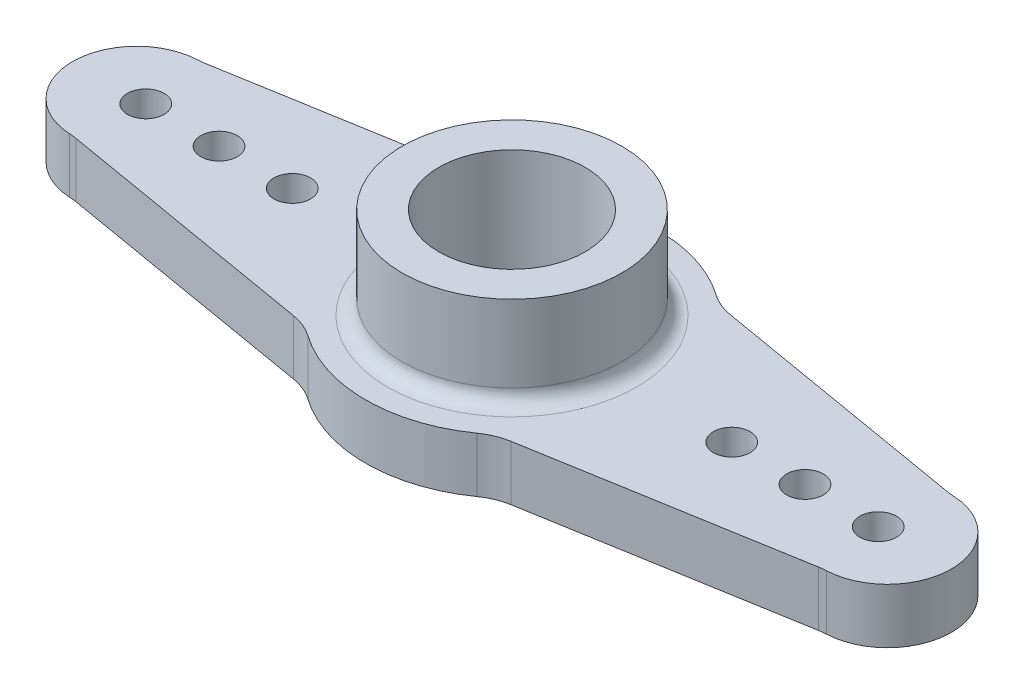
ISO-10303-21;
HEADER;
FILE_DESCRIPTION(('STEP AP214'),'2;1');
FILE_NAME('part.step','',(''),(''),'','','');
FILE_SCHEMA(('AUTOMOTIVE_DESIGN { 1 0 10303 214 1 1 1 1 }'));
ENDSEC;
DATA;
#1=APPLICATION_CONTEXT('core data for automotive mechanical design processes');
#2=APPLICATION_PROTOCOL_DEFINITION('international standard','automotive_design',2000,#1);
#3=PRODUCT_CONTEXT('',#1,'mechanical');
#4=PRODUCT('Part','Part','',(#3));
#5=PRODUCT_RELATED_PRODUCT_CATEGORY('part','',(#4));
#6=PRODUCT_DEFINITION_FORMATION('','',#4);
#7=PRODUCT_DEFINITION_CONTEXT('part definition',#1,'design');
#8=PRODUCT_DEFINITION('design','',#6,#7);
#9=PRODUCT_DEFINITION_SHAPE('','',#8);
#10=(LENGTH_UNIT() NAMED_UNIT(*) SI_UNIT(.MILLI.,.METRE.));
#11=(NAMED_UNIT(*) PLANE_ANGLE_UNIT() SI_UNIT($,.RADIAN.));
#12=(NAMED_UNIT(*) SI_UNIT($,.STERADIAN.) SOLID_ANGLE_UNIT());
#13=UNCERTAINTY_MEASURE_WITH_UNIT(LENGTH_MEASURE(1.E-05),#10,'distance_accuracy_value','');
#14=(GEOMETRIC_REPRESENTATION_CONTEXT(3) GLOBAL_UNCERTAINTY_ASSIGNED_CONTEXT((#13)) GLOBAL_UNIT_ASSIGNED_CONTEXT((#10,
#11,#12)) REPRESENTATION_CONTEXT('',''));
#15=CARTESIAN_POINT('',(0.,0.,0.));
#16=DIRECTION('',(0.,0.,1.));
#17=DIRECTION('',(1.,0.,0.));
#18=AXIS2_PLACEMENT_3D('',#15,#16,#17);
#19=CARTESIAN_POINT('',(0.,2.38125,0.));
#20=DIRECTION('',(0.,-1.,0.));
#21=DIRECTION('',(0.,0.,-1.));
#22=AXIS2_PLACEMENT_3D('',#19,#20,#21);
#23=CYLINDRICAL_SURFACE('',#22,6.35);
#24=CARTESIAN_POINT('',(0.,2.38125,0.));
#25=DIRECTION('',(0.,1.,0.));
#26=DIRECTION('',(0.,0.,1.));
#27=AXIS2_PLACEMENT_3D('',#24,#25,#26);
#28=CIRCLE('',#27,6.35);
#29=CARTESIAN_POINT('',(3.66877708974033,2.38125,-5.18291179413621));
#30=VERTEX_POINT('',#29);
#31=CARTESIAN_POINT('',(-3.6687770897404,2.38125,-5.18291179413621));
#32=VERTEX_POINT('',#31);
#33=EDGE_CURVE('E207',#30,#32,#28,.T.);
#34=ORIENTED_EDGE('',*,*,#33,.F.);
#35=DIRECTION('',(0.,-1.,0.));
#36=VECTOR('',#35,1.);
#37=CARTESIAN_POINT('',(3.66877708974033,2.38125,-5.18291179413621));
#38=LINE('',#37,#36);
#39=CARTESIAN_POINT('',(3.66877708974037,0.,-5.18291179413621));
#40=VERTEX_POINT('',#39);
#41=EDGE_CURVE('E239',#30,#40,#38,.T.);
#42=ORIENTED_EDGE('',*,*,#41,.T.);
#43=CARTESIAN_POINT('',(0.,0.,0.));
#44=DIRECTION('',(0.,1.,0.));
#45=DIRECTION('',(0.,0.,1.));
#46=AXIS2_PLACEMENT_3D('',#43,#44,#45);
#47=CIRCLE('',#46,6.35);
#48=CARTESIAN_POINT('',(-3.66877708974037,0.,-5.18291179413612));
#49=VERTEX_POINT('',#48);
#50=EDGE_CURVE('E193',#40,#49,#47,.T.);
#51=ORIENTED_EDGE('',*,*,#50,.T.);
#52=DIRECTION('',(0.,-1.,0.));
#53=VECTOR('',#52,1.);
#54=CARTESIAN_POINT('',(-3.6687770897404,2.38125,-5.18291179413621));
#55=LINE('',#54,#53);
#56=EDGE_CURVE('E237',#49,#32,#55,.F.);
#57=ORIENTED_EDGE('',*,*,#56,.T.);
#58=EDGE_LOOP('',(#34,#42,#51,#57));
#59=FACE_BOUND('',#58,.T.);
#60=ADVANCED_FACE('F45',(#59),#23,.T.);
#61=CARTESIAN_POINT('',(-16.271875,2.38124999999997,-2.778125));
#62=DIRECTION('',(0.168296462892021,0.,0.985736425510407));
#63=DIRECTION('',(0.985736425510407,0.,-0.168296462892021));
#64=AXIS2_PLACEMENT_3D('',#61,#62,#63);
#65=PLANE('',#64);
#66=DIRECTION('',(-0.985736425510407,0.,0.168296462892021));
#67=VECTOR('',#66,1.);
#68=CARTESIAN_POINT('',(-16.271875,2.38124999999997,-2.778125));
#69=LINE('',#68,#67);
#70=CARTESIAN_POINT('',(-4.70881490989078,2.38125,-4.75230599099425));
#71=VERTEX_POINT('',#70);
#72=CARTESIAN_POINT('',(-16.0939992060935,2.38124999999997,-2.80849403798406));
#73=VERTEX_POINT('',#72);
#74=EDGE_CURVE('E307',#71,#73,#69,.T.);
#75=ORIENTED_EDGE('',*,*,#74,.F.);
#76=DIRECTION('',(0.,1.,0.));
#77=VECTOR('',#76,1.);
#78=CARTESIAN_POINT('',(-4.70881490989078,0.,-4.75230599099417));
#79=LINE('',#78,#77);
#80=CARTESIAN_POINT('',(-4.70881490989078,0.,-4.75230599099417));
#81=VERTEX_POINT('',#80);
#82=EDGE_CURVE('E244',#71,#81,#79,.F.);
#83=ORIENTED_EDGE('',*,*,#82,.T.);
#84=DIRECTION('',(-0.985736425510407,0.,0.168296462892021));
#85=VECTOR('',#84,1.);
#86=CARTESIAN_POINT('',(-16.271875,0.,-2.77812499999991));
#87=LINE('',#86,#85);
#88=CARTESIAN_POINT('',(-16.0939992060935,0.,-2.80849403798404));
#89=VERTEX_POINT('',#88);
#90=EDGE_CURVE('E189',#81,#89,#87,.T.);
#91=ORIENTED_EDGE('',*,*,#90,.T.);
#92=DIRECTION('',(0.,1.,0.));
#93=VECTOR('',#92,1.);
#94=CARTESIAN_POINT('',(-16.0939992060935,2.38124999999997,-2.80849403798406));
#95=LINE('',#94,#93);
#96=EDGE_CURVE('E169',#89,#73,#95,.T.);
#97=ORIENTED_EDGE('',*,*,#96,.T.);
#98=EDGE_LOOP('',(#75,#83,#91,#97));
#99=FACE_BOUND('',#98,.T.);
#100=ADVANCED_FACE('F334',(#99),#65,.F.);
#101=CARTESIAN_POINT('',(-16.271875,2.38125,0.));
#102=DIRECTION('',(0.,-1.,0.));
#103=DIRECTION('',(0.,0.,-1.));
#104=AXIS2_PLACEMENT_3D('',#101,#102,#103);
#105=CYLINDRICAL_SURFACE('',#104,2.778125);
#106=CARTESIAN_POINT('',(-16.271875,2.38125,0.));
#107=DIRECTION('',(0.,1.,0.));
#108=DIRECTION('',(0.,0.,1.));
#109=AXIS2_PLACEMENT_3D('',#106,#107,#108);
#110=CIRCLE('',#109,2.778125);
#111=CARTESIAN_POINT('',(-16.4022616084235,2.38124999999997,-2.77506357548234));
#112=VERTEX_POINT('',#111);
#113=CARTESIAN_POINT('',(-16.4022616084235,2.38125,2.77506357548234));
#114=VERTEX_POINT('',#113);
#115=EDGE_CURVE('E182',#112,#114,#110,.T.);
#116=ORIENTED_EDGE('',*,*,#115,.F.);
#117=DIRECTION('',(0.,-1.,0.));
#118=VECTOR('',#117,1.);
#119=CARTESIAN_POINT('',(-16.4022616084235,2.38124999999997,-2.77506357548234));
#120=LINE('',#119,#118);
#121=CARTESIAN_POINT('',(-16.4022616084235,0.,-2.77506357548225));
#122=VERTEX_POINT('',#121);
#123=EDGE_CURVE('E167',#112,#122,#120,.T.);
#124=ORIENTED_EDGE('',*,*,#123,.T.);
#125=CARTESIAN_POINT('',(-16.271875,0.,0.));
#126=DIRECTION('',(0.,1.,0.));
#127=DIRECTION('',(0.,0.,1.));
#128=AXIS2_PLACEMENT_3D('',#125,#126,#127);
#129=CIRCLE('',#128,2.778125);
#130=CARTESIAN_POINT('',(-16.4022616084235,0.,2.77506357548243));
#131=VERTEX_POINT('',#130);
#132=EDGE_CURVE('E179',#122,#131,#129,.T.);
#133=ORIENTED_EDGE('',*,*,#132,.T.);
#134=DIRECTION('',(0.,-1.,0.));
#135=VECTOR('',#134,1.);
#136=CARTESIAN_POINT('',(-16.4022616084235,2.38125,2.77506357548234));
#137=LINE('',#136,#135);
#138=EDGE_CURVE('E183',#131,#114,#137,.F.);
#139=ORIENTED_EDGE('',*,*,#138,.T.);
#140=EDGE_LOOP('',(#116,#124,#133,#139));
#141=FACE_BOUND('',#140,.T.);
#142=ADVANCED_FACE('F178',(#141),#105,.T.);
#143=CARTESIAN_POINT('',(-4.08917959896391,2.38125,4.85809738554274));
#144=DIRECTION('',(0.168296462892021,0.,-0.985736425510407));
#145=DIRECTION('',(-0.985736425510407,0.,-0.168296462892021));
#146=AXIS2_PLACEMENT_3D('',#143,#144,#145);
#147=PLANE('',#146);
#148=DIRECTION('',(0.985736425510407,0.,0.168296462892021));
#149=VECTOR('',#148,1.);
#150=CARTESIAN_POINT('',(-4.08917959896392,0.,4.85809738554275));
#151=LINE('',#150,#149);
#152=CARTESIAN_POINT('',(-16.0939992060935,0.,2.80849403798405));
#153=VERTEX_POINT('',#152);
#154=CARTESIAN_POINT('',(-4.70881490989078,-3.05311331771918E-13,4.75230599099435));
#155=VERTEX_POINT('',#154);
#156=EDGE_CURVE('E188',#153,#155,#151,.T.);
#157=ORIENTED_EDGE('',*,*,#156,.T.);
#158=DIRECTION('',(0.,1.,0.));
#159=VECTOR('',#158,1.);
#160=CARTESIAN_POINT('',(-4.70881490989082,2.3812499999997,4.75230599099426));
#161=LINE('',#160,#159);
#162=CARTESIAN_POINT('',(-4.70881490989082,2.3812499999997,4.75230599099426));
#163=VERTEX_POINT('',#162);
#164=EDGE_CURVE('E69',#155,#163,#161,.T.);
#165=ORIENTED_EDGE('',*,*,#164,.T.);
#166=DIRECTION('',(0.985736425510407,0.,0.168296462892021));
#167=VECTOR('',#166,1.);
#168=CARTESIAN_POINT('',(-4.08917959896391,2.38125,4.85809738554274));
#169=LINE('',#168,#167);
#170=CARTESIAN_POINT('',(-16.0939992060935,2.38125,2.80849403798404));
#171=VERTEX_POINT('',#170);
#172=EDGE_CURVE('E310',#171,#163,#169,.T.);
#173=ORIENTED_EDGE('',*,*,#172,.F.);
#174=DIRECTION('',(0.,1.,0.));
#175=VECTOR('',#174,1.);
#176=CARTESIAN_POINT('',(-16.0939992060935,0.,2.80849403798405));
#177=LINE('',#176,#175);
#178=EDGE_CURVE('E211',#171,#153,#177,.F.);
#179=ORIENTED_EDGE('',*,*,#178,.T.);
#180=EDGE_LOOP('',(#157,#165,#173,#179));
#181=FACE_BOUND('',#180,.T.);
#182=ADVANCED_FACE('F339',(#181),#147,.F.);
#183=CARTESIAN_POINT('',(0.,2.38125,0.));
#184=DIRECTION('',(0.,-1.,0.));
#185=DIRECTION('',(0.,0.,-1.));
#186=AXIS2_PLACEMENT_3D('',#183,#184,#185);
#187=CYLINDRICAL_SURFACE('',#186,6.35);
#188=CARTESIAN_POINT('',(0.,0.,0.));
#189=DIRECTION('',(0.,1.,0.));
#190=DIRECTION('',(0.,0.,1.));
#191=AXIS2_PLACEMENT_3D('',#188,#189,#190);
#192=CIRCLE('',#191,6.35);
#193=CARTESIAN_POINT('',(-3.66877708974037,0.,5.1829117941363));
#194=VERTEX_POINT('',#193);
#195=CARTESIAN_POINT('',(3.66877708974037,0.,5.18291179413621));
#196=VERTEX_POINT('',#195);
#197=EDGE_CURVE('E191',#194,#196,#192,.T.);
#198=ORIENTED_EDGE('',*,*,#197,.T.);
#199=DIRECTION('',(0.,-1.,0.));
#200=VECTOR('',#199,1.);
#201=CARTESIAN_POINT('',(3.66877708974033,2.38124999999997,5.1829117941362));
#202=LINE('',#201,#200);
#203=CARTESIAN_POINT('',(3.66877708974033,2.38124999999997,5.1829117941362));
#204=VERTEX_POINT('',#203);
#205=EDGE_CURVE('E253',#196,#204,#202,.F.);
#206=ORIENTED_EDGE('',*,*,#205,.T.);
#207=CARTESIAN_POINT('',(0.,2.38125,0.));
#208=DIRECTION('',(0.,1.,0.));
#209=DIRECTION('',(0.,0.,1.));
#210=AXIS2_PLACEMENT_3D('',#207,#208,#209);
#211=CIRCLE('',#210,6.35);
#212=CARTESIAN_POINT('',(-3.6687770897404,2.38124999999997,5.18291179413621));
#213=VERTEX_POINT('',#212);
#214=EDGE_CURVE('E312',#213,#204,#211,.T.);
#215=ORIENTED_EDGE('',*,*,#214,.F.);
#216=DIRECTION('',(0.,-1.,0.));
#217=VECTOR('',#216,1.);
#218=CARTESIAN_POINT('',(-3.6687770897404,2.38124999999997,5.18291179413621));
#219=LINE('',#218,#217);
#220=EDGE_CURVE('E250',#213,#194,#219,.T.);
#221=ORIENTED_EDGE('',*,*,#220,.T.);
#222=EDGE_LOOP('',(#198,#206,#215,#221));
#223=FACE_BOUND('',#222,.T.);
#224=ADVANCED_FACE('F346',(#223),#187,.T.);
#225=CARTESIAN_POINT('',(16.271875,2.38125,2.77812499999999));
#226=DIRECTION('',(-0.168296462892021,0.,-0.985736425510407));
#227=DIRECTION('',(-0.985736425510407,0.,0.168296462892021));
#228=AXIS2_PLACEMENT_3D('',#225,#226,#227);
#229=PLANE('',#228);
#230=DIRECTION('',(0.985736425510407,0.,-0.168296462892021));
#231=VECTOR('',#230,1.);
#232=CARTESIAN_POINT('',(16.271875,2.38125,2.77812499999999));
#233=LINE('',#232,#231);
#234=CARTESIAN_POINT('',(4.70881490989078,2.38124999999997,4.75230599099424));
#235=VERTEX_POINT('',#234);
#236=CARTESIAN_POINT('',(16.0939992060934,2.38125,2.80849403798405));
#237=VERTEX_POINT('',#236);
#238=EDGE_CURVE('E315',#235,#237,#233,.T.);
#239=ORIENTED_EDGE('',*,*,#238,.F.);
#240=DIRECTION('',(0.,1.,0.));
#241=VECTOR('',#240,1.);
#242=CARTESIAN_POINT('',(4.70881490989078,0.,4.75230599099426));
#243=LINE('',#242,#241);
#244=CARTESIAN_POINT('',(4.70881490989078,0.,4.75230599099426));
#245=VERTEX_POINT('',#244);
#246=EDGE_CURVE('E247',#235,#245,#243,.F.);
#247=ORIENTED_EDGE('',*,*,#246,.T.);
#248=DIRECTION('',(0.985736425510407,0.,-0.168296462892021));
#249=VECTOR('',#248,1.);
#250=CARTESIAN_POINT('',(16.271875,0.,2.778125));
#251=LINE('',#250,#249);
#252=CARTESIAN_POINT('',(16.0939992060934,0.,2.80849403798414));
#253=VERTEX_POINT('',#252);
#254=EDGE_CURVE('E199',#245,#253,#251,.T.);
#255=ORIENTED_EDGE('',*,*,#254,.T.);
#256=DIRECTION('',(0.,1.,0.));
#257=VECTOR('',#256,1.);
#258=CARTESIAN_POINT('',(16.0939992060934,2.38125,2.80849403798405));
#259=LINE('',#258,#257);
#260=EDGE_CURVE('E173',#253,#237,#259,.T.);
#261=ORIENTED_EDGE('',*,*,#260,.T.);
#262=EDGE_LOOP('',(#239,#247,#255,#261));
#263=FACE_BOUND('',#262,.T.);
#264=ADVANCED_FACE('F355',(#263),#229,.F.);
#265=CARTESIAN_POINT('',(16.271875,2.38125,0.));
#266=DIRECTION('',(0.,-1.,0.));
#267=DIRECTION('',(0.,0.,-1.));
#268=AXIS2_PLACEMENT_3D('',#265,#266,#267);
#269=CYLINDRICAL_SURFACE('',#268,2.778125);
#270=CARTESIAN_POINT('',(16.271875,0.,0.));
#271=DIRECTION('',(0.,1.,0.));
#272=DIRECTION('',(0.,0.,1.));
#273=AXIS2_PLACEMENT_3D('',#270,#271,#272);
#274=CIRCLE('',#273,2.778125);
#275=CARTESIAN_POINT('',(16.4022616084234,0.,2.77506357548234));
#276=VERTEX_POINT('',#275);
#277=CARTESIAN_POINT('',(16.4022616084235,0.,-2.77506357548234));
#278=VERTEX_POINT('',#277);
#279=EDGE_CURVE('E201',#276,#278,#274,.T.);
#280=ORIENTED_EDGE('',*,*,#279,.T.);
#281=DIRECTION('',(0.,-1.,0.));
#282=VECTOR('',#281,1.);
#283=CARTESIAN_POINT('',(16.4022616084235,2.38124999999997,-2.77506357548234));
#284=LINE('',#283,#282);
#285=CARTESIAN_POINT('',(16.4022616084235,2.38124999999997,-2.77506357548234));
#286=VERTEX_POINT('',#285);
#287=EDGE_CURVE('E220',#278,#286,#284,.F.);
#288=ORIENTED_EDGE('',*,*,#287,.T.);
#289=CARTESIAN_POINT('',(16.271875,2.38125,0.));
#290=DIRECTION('',(0.,1.,0.));
#291=DIRECTION('',(0.,0.,1.));
#292=AXIS2_PLACEMENT_3D('',#289,#290,#291);
#293=CIRCLE('',#292,2.778125);
#294=CARTESIAN_POINT('',(16.4022616084234,2.38125,2.77506357548234));
#295=VERTEX_POINT('',#294);
#296=EDGE_CURVE('E317',#295,#286,#293,.T.);
#297=ORIENTED_EDGE('',*,*,#296,.F.);
#298=DIRECTION('',(0.,-1.,0.));
#299=VECTOR('',#298,1.);
#300=CARTESIAN_POINT('',(16.4022616084234,2.38125,2.77506357548234));
#301=LINE('',#300,#299);
#302=EDGE_CURVE('E217',#295,#276,#301,.T.);
#303=ORIENTED_EDGE('',*,*,#302,.T.);
#304=EDGE_LOOP('',(#280,#288,#297,#303));
#305=FACE_BOUND('',#304,.T.);
#306=ADVANCED_FACE('F363',(#305),#269,.T.);
#307=CARTESIAN_POINT('',(4.08917959896393,2.38124999999997,-4.85809738554274));
#308=DIRECTION('',(-0.168296462892021,0.,0.985736425510407));
#309=DIRECTION('',(0.985736425510407,0.,0.168296462892021));
#310=AXIS2_PLACEMENT_3D('',#307,#308,#309);
#311=PLANE('',#310);
#312=DIRECTION('',(-0.985736425510407,0.,-0.168296462892021));
#313=VECTOR('',#312,1.);
#314=CARTESIAN_POINT('',(4.08917959896393,0.,-4.85809738554274));
#315=LINE('',#314,#313);
#316=CARTESIAN_POINT('',(16.0939992060935,0.,-2.80849403798396));
#317=VERTEX_POINT('',#316);
#318=CARTESIAN_POINT('',(4.70881490989078,0.,-4.75230599099426));
#319=VERTEX_POINT('',#318);
#320=EDGE_CURVE('E204',#317,#319,#315,.T.);
#321=ORIENTED_EDGE('',*,*,#320,.T.);
#322=DIRECTION('',(0.,1.,0.));
#323=VECTOR('',#322,1.);
#324=CARTESIAN_POINT('',(4.70881490989078,2.38124999999997,-4.75230599099426));
#325=LINE('',#324,#323);
#326=CARTESIAN_POINT('',(4.70881490989078,2.38124999999997,-4.75230599099426));
#327=VERTEX_POINT('',#326);
#328=EDGE_CURVE('E242',#319,#327,#325,.T.);
#329=ORIENTED_EDGE('',*,*,#328,.T.);
#330=DIRECTION('',(-0.985736425510407,0.,-0.168296462892021));
#331=VECTOR('',#330,1.);
#332=CARTESIAN_POINT('',(4.08917959896393,2.38124999999997,-4.85809738554274));
#333=LINE('',#332,#331);
#334=CARTESIAN_POINT('',(16.0939992060935,2.38124999999997,-2.80849403798404));
#335=VERTEX_POINT('',#334);
#336=EDGE_CURVE('E208',#335,#327,#333,.T.);
#337=ORIENTED_EDGE('',*,*,#336,.F.);
#338=DIRECTION('',(0.,1.,0.));
#339=VECTOR('',#338,1.);
#340=CARTESIAN_POINT('',(16.0939992060935,0.,-2.80849403798396));
#341=LINE('',#340,#339);
#342=EDGE_CURVE('E214',#335,#317,#341,.F.);
#343=ORIENTED_EDGE('',*,*,#342,.T.);
#344=EDGE_LOOP('',(#321,#329,#337,#343));
#345=FACE_BOUND('',#344,.T.);
#346=ADVANCED_FACE('F374',(#345),#311,.F.);
#347=CARTESIAN_POINT('',(0.,2.38125,0.));
#348=DIRECTION('',(0.,1.,0.));
#349=DIRECTION('',(0.,0.,1.));
#350=AXIS2_PLACEMENT_3D('',#347,#348,#349);
#351=PLANE('',#350);
#352=CARTESIAN_POINT('',(-15.875,2.38125,0.));
#353=DIRECTION('',(0.,1.,0.));
#354=DIRECTION('',(0.,0.,1.));
#355=AXIS2_PLACEMENT_3D('',#352,#353,#354);
#356=CIRCLE('',#355,0.793749999999999);
#357=CARTESIAN_POINT('',(-15.875,2.38125,0.793749999999999));
#358=VERTEX_POINT('',#357);
#359=EDGE_CURVE('E582',#358,#358,#356,.T.);
#360=ORIENTED_EDGE('',*,*,#359,.F.);
#361=EDGE_LOOP('',(#360));
#362=FACE_BOUND('',#361,.T.);
#363=CARTESIAN_POINT('',(15.875,2.38125,0.));
#364=DIRECTION('',(0.,1.,0.));
#365=DIRECTION('',(0.,0.,1.));
#366=AXIS2_PLACEMENT_3D('',#363,#364,#365);
#367=CIRCLE('',#366,0.793749999999999);
#368=CARTESIAN_POINT('',(15.875,2.38125,0.793749999999999));
#369=VERTEX_POINT('',#368);
#370=EDGE_CURVE('E586',#369,#369,#367,.T.);
#371=ORIENTED_EDGE('',*,*,#370,.F.);
#372=EDGE_LOOP('',(#371));
#373=FACE_BOUND('',#372,.T.);
#374=CARTESIAN_POINT('',(12.7,2.3812499999997,0.));
#375=DIRECTION('',(0.,1.,0.));
#376=DIRECTION('',(0.,0.,1.));
#377=AXIS2_PLACEMENT_3D('',#374,#375,#376);
#378=CIRCLE('',#377,0.793749999999999);
#379=CARTESIAN_POINT('',(12.7,2.3812499999997,0.793749999999909));
#380=VERTEX_POINT('',#379);
#381=EDGE_CURVE('E590',#380,#380,#378,.T.);
#382=ORIENTED_EDGE('',*,*,#381,.F.);
#383=EDGE_LOOP('',(#382));
#384=FACE_BOUND('',#383,.T.);
#385=CARTESIAN_POINT('',(-12.7,2.38125,0.));
#386=DIRECTION('',(0.,1.,0.));
#387=DIRECTION('',(0.,0.,1.));
#388=AXIS2_PLACEMENT_3D('',#385,#386,#387);
#389=CIRCLE('',#388,0.793749999999999);
#390=CARTESIAN_POINT('',(-12.7,2.38125,0.793749999999909));
#391=VERTEX_POINT('',#390);
#392=EDGE_CURVE('E594',#391,#391,#389,.T.);
#393=ORIENTED_EDGE('',*,*,#392,.F.);
#394=EDGE_LOOP('',(#393));
#395=FACE_BOUND('',#394,.T.);
#396=CARTESIAN_POINT('',(-9.52500000000001,2.38124999999997,0.));
#397=DIRECTION('',(0.,1.,0.));
#398=DIRECTION('',(0.,0.,1.));
#399=AXIS2_PLACEMENT_3D('',#396,#397,#398);
#400=CIRCLE('',#399,0.793749999999999);
#401=CARTESIAN_POINT('',(-9.52500000000001,2.38124999999997,0.793749999999999));
#402=VERTEX_POINT('',#401);
#403=EDGE_CURVE('E598',#402,#402,#400,.T.);
#404=ORIENTED_EDGE('',*,*,#403,.F.);
#405=EDGE_LOOP('',(#404));
#406=FACE_BOUND('',#405,.T.);
#407=CARTESIAN_POINT('',(9.525,2.38125,0.));
#408=DIRECTION('',(0.,1.,0.));
#409=DIRECTION('',(0.,0.,1.));
#410=AXIS2_PLACEMENT_3D('',#407,#408,#409);
#411=CIRCLE('',#410,0.793749999999999);
#412=CARTESIAN_POINT('',(9.525,2.38125,0.793749999999999));
#413=VERTEX_POINT('',#412);
#414=EDGE_CURVE('E277',#413,#413,#411,.T.);
#415=ORIENTED_EDGE('',*,*,#414,.F.);
#416=EDGE_LOOP('',(#415));
#417=FACE_BOUND('',#416,.T.);
#418=CARTESIAN_POINT('',(0.,2.38125,0.));
#419=DIRECTION('',(0.,1.,0.));
#420=DIRECTION('',(0.,0.,1.));
#421=AXIS2_PLACEMENT_3D('',#418,#419,#420);
#422=CIRCLE('',#421,5.3975);
#423=CARTESIAN_POINT('',(0.,2.38125,5.39749999999991));
#424=VERTEX_POINT('',#423);
#425=EDGE_CURVE('E13',#424,#424,#422,.F.);
#426=ORIENTED_EDGE('',*,*,#425,.T.);
#427=EDGE_LOOP('',(#426));
#428=FACE_BOUND('',#427,.T.);
#429=ORIENTED_EDGE('',*,*,#336,.T.);
#430=CARTESIAN_POINT('',(5.13628792563652,2.38124999999997,-7.25607651179069));
#431=DIRECTION('',(0.,1.,0.));
#432=DIRECTION('',(0.,0.,1.));
#433=AXIS2_PLACEMENT_3D('',#430,#431,#432);
#434=CIRCLE('',#433,2.54);
#435=EDGE_CURVE('E258',#327,#30,#434,.F.);
#436=ORIENTED_EDGE('',*,*,#435,.T.);
#437=ORIENTED_EDGE('',*,*,#33,.T.);
#438=CARTESIAN_POINT('',(-5.13628792563651,2.3812499999997,-7.25607651179069));
#439=DIRECTION('',(0.,1.,0.));
#440=DIRECTION('',(0.,0.,1.));
#441=AXIS2_PLACEMENT_3D('',#438,#439,#440);
#442=CIRCLE('',#441,2.54);
#443=EDGE_CURVE('E262',#32,#71,#442,.F.);
#444=ORIENTED_EDGE('',*,*,#443,.T.);
#445=ORIENTED_EDGE('',*,*,#74,.T.);
#446=CARTESIAN_POINT('',(-16.5214722218392,2.3812499999997,-5.31226455878048));
#447=DIRECTION('',(0.,1.,0.));
#448=DIRECTION('',(0.,0.,1.));
#449=AXIS2_PLACEMENT_3D('',#446,#447,#448);
#450=CIRCLE('',#449,2.54);
#451=EDGE_CURVE('E172',#73,#112,#450,.F.);
#452=ORIENTED_EDGE('',*,*,#451,.T.);
#453=ORIENTED_EDGE('',*,*,#115,.T.);
#454=CARTESIAN_POINT('',(-16.5214722218392,2.38124999999997,5.31226455878048));
#455=DIRECTION('',(0.,1.,0.));
#456=DIRECTION('',(0.,0.,1.));
#457=AXIS2_PLACEMENT_3D('',#454,#455,#456);
#458=CIRCLE('',#457,2.54);
#459=EDGE_CURVE('E226',#114,#171,#458,.F.);
#460=ORIENTED_EDGE('',*,*,#459,.T.);
#461=ORIENTED_EDGE('',*,*,#172,.T.);
#462=CARTESIAN_POINT('',(-5.13628792563651,2.38125,7.25607651179069));
#463=DIRECTION('',(0.,1.,0.));
#464=DIRECTION('',(0.,0.,1.));
#465=AXIS2_PLACEMENT_3D('',#462,#463,#464);
#466=CIRCLE('',#465,2.54);
#467=EDGE_CURVE('E269',#163,#213,#466,.F.);
#468=ORIENTED_EDGE('',*,*,#467,.T.);
#469=ORIENTED_EDGE('',*,*,#214,.T.);
#470=CARTESIAN_POINT('',(5.1362879256365,2.38124999999997,7.25607651179069));
#471=DIRECTION('',(0.,1.,0.));
#472=DIRECTION('',(0.,0.,1.));
#473=AXIS2_PLACEMENT_3D('',#470,#471,#472);
#474=CIRCLE('',#473,2.54);
#475=EDGE_CURVE('E266',#204,#235,#474,.F.);
#476=ORIENTED_EDGE('',*,*,#475,.T.);
#477=ORIENTED_EDGE('',*,*,#238,.T.);
#478=CARTESIAN_POINT('',(16.5214722218392,2.38124999999997,5.31226455878048));
#479=DIRECTION('',(0.,1.,0.));
#480=DIRECTION('',(0.,0.,1.));
#481=AXIS2_PLACEMENT_3D('',#478,#479,#480);
#482=CIRCLE('',#481,2.54);
#483=EDGE_CURVE('E235',#237,#295,#482,.F.);
#484=ORIENTED_EDGE('',*,*,#483,.T.);
#485=ORIENTED_EDGE('',*,*,#296,.T.);
#486=CARTESIAN_POINT('',(16.5214722218392,2.38125,-5.31226455878048));
#487=DIRECTION('',(0.,1.,0.));
#488=DIRECTION('',(0.,0.,1.));
#489=AXIS2_PLACEMENT_3D('',#486,#487,#488);
#490=CIRCLE('',#489,2.54);
#491=EDGE_CURVE('E230',#286,#335,#490,.F.);
#492=ORIENTED_EDGE('',*,*,#491,.T.);
#493=EDGE_LOOP('',(#429,#436,#437,#444,#445,#452,#453,#460,#461,#468,#469,#476,#477,#484,#485,#492));
#494=FACE_BOUND('',#493,.T.);
#495=ADVANCED_FACE('F332',(#362,#373,#384,#395,#406,#417,#428,#494),#351,.T.);
#496=CARTESIAN_POINT('',(0.,0.,0.));
#497=DIRECTION('',(0.,1.,0.));
#498=DIRECTION('',(0.,0.,1.));
#499=AXIS2_PLACEMENT_3D('',#496,#497,#498);
#500=PLANE('',#499);
#501=CARTESIAN_POINT('',(-15.875,0.,0.));
#502=DIRECTION('',(0.,1.,0.));
#503=DIRECTION('',(0.,0.,1.));
#504=AXIS2_PLACEMENT_3D('',#501,#502,#503);
#505=CIRCLE('',#504,0.793749999999999);
#506=CARTESIAN_POINT('',(-15.875,0.,0.793749999999999));
#507=VERTEX_POINT('',#506);
#508=EDGE_CURVE('E49',#507,#507,#505,.T.);
#509=ORIENTED_EDGE('',*,*,#508,.T.);
#510=EDGE_LOOP('',(#509));
#511=FACE_BOUND('',#510,.T.);
#512=CARTESIAN_POINT('',(15.875,0.,0.));
#513=DIRECTION('',(0.,1.,0.));
#514=DIRECTION('',(0.,0.,1.));
#515=AXIS2_PLACEMENT_3D('',#512,#513,#514);
#516=CIRCLE('',#515,0.793749999999999);
#517=CARTESIAN_POINT('',(15.875,0.,0.79375000000009));
#518=VERTEX_POINT('',#517);
#519=EDGE_CURVE('E285',#518,#518,#516,.T.);
#520=ORIENTED_EDGE('',*,*,#519,.T.);
#521=EDGE_LOOP('',(#520));
#522=FACE_BOUND('',#521,.T.);
#523=CARTESIAN_POINT('',(12.7,-3.05311331771918E-13,0.));
#524=DIRECTION('',(0.,1.,0.));
#525=DIRECTION('',(0.,0.,1.));
#526=AXIS2_PLACEMENT_3D('',#523,#524,#525);
#527=CIRCLE('',#526,0.793749999999999);
#528=CARTESIAN_POINT('',(12.7,-3.05311331771918E-13,0.793749999999999));
#529=VERTEX_POINT('',#528);
#530=EDGE_CURVE('E283',#529,#529,#527,.T.);
#531=ORIENTED_EDGE('',*,*,#530,.T.);
#532=EDGE_LOOP('',(#531));
#533=FACE_BOUND('',#532,.T.);
#534=CARTESIAN_POINT('',(-12.7,0.,0.));
#535=DIRECTION('',(0.,1.,0.));
#536=DIRECTION('',(0.,0.,1.));
#537=AXIS2_PLACEMENT_3D('',#534,#535,#536);
#538=CIRCLE('',#537,0.793749999999999);
#539=CARTESIAN_POINT('',(-12.7,0.,0.793749999999999));
#540=VERTEX_POINT('',#539);
#541=EDGE_CURVE('E280',#540,#540,#538,.T.);
#542=ORIENTED_EDGE('',*,*,#541,.T.);
#543=EDGE_LOOP('',(#542));
#544=FACE_BOUND('',#543,.T.);
#545=CARTESIAN_POINT('',(-9.525,0.,0.));
#546=DIRECTION('',(0.,1.,0.));
#547=DIRECTION('',(0.,0.,1.));
#548=AXIS2_PLACEMENT_3D('',#545,#546,#547);
#549=CIRCLE('',#548,0.793749999999999);
#550=CARTESIAN_POINT('',(-9.525,0.,0.79375000000009));
#551=VERTEX_POINT('',#550);
#552=EDGE_CURVE('E276',#551,#551,#549,.T.);
#553=ORIENTED_EDGE('',*,*,#552,.T.);
#554=EDGE_LOOP('',(#553));
#555=FACE_BOUND('',#554,.T.);
#556=CARTESIAN_POINT('',(9.525,0.,0.));
#557=DIRECTION('',(0.,1.,0.));
#558=DIRECTION('',(0.,0.,1.));
#559=AXIS2_PLACEMENT_3D('',#556,#557,#558);
#560=CIRCLE('',#559,0.793749999999999);
#561=CARTESIAN_POINT('',(9.525,0.,0.793749999999999));
#562=VERTEX_POINT('',#561);
#563=EDGE_CURVE('E273',#562,#562,#560,.T.);
#564=ORIENTED_EDGE('',*,*,#563,.T.);
#565=EDGE_LOOP('',(#564));
#566=FACE_BOUND('',#565,.T.);
#567=CARTESIAN_POINT('',(0.,0.,0.));
#568=DIRECTION('',(0.,1.,0.));
#569=DIRECTION('',(0.,0.,1.));
#570=AXIS2_PLACEMENT_3D('',#567,#568,#569);
#571=CIRCLE('',#570,3.175);
#572=CARTESIAN_POINT('',(0.,0.,3.175));
#573=VERTEX_POINT('',#572);
#574=EDGE_CURVE('E294',#573,#573,#571,.T.);
#575=ORIENTED_EDGE('',*,*,#574,.T.);
#576=EDGE_LOOP('',(#575));
#577=FACE_BOUND('',#576,.T.);
#578=ORIENTED_EDGE('',*,*,#50,.F.);
#579=CARTESIAN_POINT('',(5.13628792563652,0.,-7.25607651179069));
#580=DIRECTION('',(0.,1.,0.));
#581=DIRECTION('',(0.,0.,1.));
#582=AXIS2_PLACEMENT_3D('',#579,#580,#581);
#583=CIRCLE('',#582,2.54);
#584=EDGE_CURVE('E256',#40,#319,#583,.T.);
#585=ORIENTED_EDGE('',*,*,#584,.T.);
#586=ORIENTED_EDGE('',*,*,#320,.F.);
#587=CARTESIAN_POINT('',(16.5214722218392,0.,-5.31226455878048));
#588=DIRECTION('',(0.,1.,0.));
#589=DIRECTION('',(0.,0.,1.));
#590=AXIS2_PLACEMENT_3D('',#587,#588,#589);
#591=CIRCLE('',#590,2.54);
#592=EDGE_CURVE('E228',#317,#278,#591,.T.);
#593=ORIENTED_EDGE('',*,*,#592,.T.);
#594=ORIENTED_EDGE('',*,*,#279,.F.);
#595=CARTESIAN_POINT('',(16.5214722218392,0.,5.31226455878048));
#596=DIRECTION('',(0.,1.,0.));
#597=DIRECTION('',(0.,0.,1.));
#598=AXIS2_PLACEMENT_3D('',#595,#596,#597);
#599=CIRCLE('',#598,2.54);
#600=EDGE_CURVE('E232',#276,#253,#599,.T.);
#601=ORIENTED_EDGE('',*,*,#600,.T.);
#602=ORIENTED_EDGE('',*,*,#254,.F.);
#603=CARTESIAN_POINT('',(5.1362879256365,0.,7.2560765117907));
#604=DIRECTION('',(0.,1.,0.));
#605=DIRECTION('',(0.,0.,1.));
#606=AXIS2_PLACEMENT_3D('',#603,#604,#605);
#607=CIRCLE('',#606,2.54);
#608=EDGE_CURVE('E264',#245,#196,#607,.T.);
#609=ORIENTED_EDGE('',*,*,#608,.T.);
#610=ORIENTED_EDGE('',*,*,#197,.F.);
#611=CARTESIAN_POINT('',(-5.13628792563652,0.,7.25607651179069));
#612=DIRECTION('',(0.,1.,0.));
#613=DIRECTION('',(0.,0.,1.));
#614=AXIS2_PLACEMENT_3D('',#611,#612,#613);
#615=CIRCLE('',#614,2.54);
#616=EDGE_CURVE('E62',#194,#155,#615,.T.);
#617=ORIENTED_EDGE('',*,*,#616,.T.);
#618=ORIENTED_EDGE('',*,*,#156,.F.);
#619=CARTESIAN_POINT('',(-16.5214722218392,0.,5.31226455878057));
#620=DIRECTION('',(0.,1.,0.));
#621=DIRECTION('',(0.,0.,1.));
#622=AXIS2_PLACEMENT_3D('',#619,#620,#621);
#623=CIRCLE('',#622,2.54);
#624=EDGE_CURVE('E187',#153,#131,#623,.T.);
#625=ORIENTED_EDGE('',*,*,#624,.T.);
#626=ORIENTED_EDGE('',*,*,#132,.F.);
#627=CARTESIAN_POINT('',(-16.5214722218392,-3.05311331771918E-13,-5.31226455878039));
#628=DIRECTION('',(0.,1.,0.));
#629=DIRECTION('',(0.,0.,1.));
#630=AXIS2_PLACEMENT_3D('',#627,#628,#629);
#631=CIRCLE('',#630,2.54);
#632=EDGE_CURVE('E163',#122,#89,#631,.T.);
#633=ORIENTED_EDGE('',*,*,#632,.T.);
#634=ORIENTED_EDGE('',*,*,#90,.F.);
#635=CARTESIAN_POINT('',(-5.13628792563651,-3.05311331771918E-13,-7.25607651179068));
#636=DIRECTION('',(0.,1.,0.));
#637=DIRECTION('',(0.,0.,1.));
#638=AXIS2_PLACEMENT_3D('',#635,#636,#637);
#639=CIRCLE('',#638,2.54);
#640=EDGE_CURVE('E260',#81,#49,#639,.T.);
#641=ORIENTED_EDGE('',*,*,#640,.T.);
#642=EDGE_LOOP('',(#578,#585,#586,#593,#594,#601,#602,#609,#610,#617,#618,#625,#626,#633,#634,#641));
#643=FACE_BOUND('',#642,.T.);
#644=ADVANCED_FACE('F186',(#511,#522,#533,#544,#555,#566,#577,#643),#500,.F.);
#645=CARTESIAN_POINT('',(-16.5214722218392,2.3812499999997,-5.31226455878048));
#646=DIRECTION('',(0.,-1.,0.));
#647=DIRECTION('',(0.,0.,-1.));
#648=AXIS2_PLACEMENT_3D('',#645,#646,#647);
#649=CYLINDRICAL_SURFACE('',#648,2.54);
#650=ORIENTED_EDGE('',*,*,#451,.F.);
#651=ORIENTED_EDGE('',*,*,#96,.F.);
#652=ORIENTED_EDGE('',*,*,#632,.F.);
#653=ORIENTED_EDGE('',*,*,#123,.F.);
#654=EDGE_LOOP('',(#650,#651,#652,#653));
#655=FACE_BOUND('',#654,.T.);
#656=ADVANCED_FACE('F166',(#655),#649,.F.);
#657=CARTESIAN_POINT('',(-16.5214722218392,2.38124999999997,5.31226455878048));
#658=DIRECTION('',(0.,-1.,0.));
#659=DIRECTION('',(0.,0.,-1.));
#660=AXIS2_PLACEMENT_3D('',#657,#658,#659);
#661=CYLINDRICAL_SURFACE('',#660,2.54);
#662=ORIENTED_EDGE('',*,*,#459,.F.);
#663=ORIENTED_EDGE('',*,*,#138,.F.);
#664=ORIENTED_EDGE('',*,*,#624,.F.);
#665=ORIENTED_EDGE('',*,*,#178,.F.);
#666=EDGE_LOOP('',(#662,#663,#664,#665));
#667=FACE_BOUND('',#666,.T.);
#668=ADVANCED_FACE('F338',(#667),#661,.F.);
#669=CARTESIAN_POINT('',(16.5214722218392,2.38125,-5.31226455878048));
#670=DIRECTION('',(0.,-1.,0.));
#671=DIRECTION('',(0.,0.,-1.));
#672=AXIS2_PLACEMENT_3D('',#669,#670,#671);
#673=CYLINDRICAL_SURFACE('',#672,2.54);
#674=ORIENTED_EDGE('',*,*,#491,.F.);
#675=ORIENTED_EDGE('',*,*,#287,.F.);
#676=ORIENTED_EDGE('',*,*,#592,.F.);
#677=ORIENTED_EDGE('',*,*,#342,.F.);
#678=EDGE_LOOP('',(#674,#675,#676,#677));
#679=FACE_BOUND('',#678,.T.);
#680=ADVANCED_FACE('F369',(#679),#673,.F.);
#681=CARTESIAN_POINT('',(16.5214722218392,2.38124999999997,5.31226455878048));
#682=DIRECTION('',(0.,-1.,0.));
#683=DIRECTION('',(0.,0.,-1.));
#684=AXIS2_PLACEMENT_3D('',#681,#682,#683);
#685=CYLINDRICAL_SURFACE('',#684,2.54);
#686=ORIENTED_EDGE('',*,*,#483,.F.);
#687=ORIENTED_EDGE('',*,*,#260,.F.);
#688=ORIENTED_EDGE('',*,*,#600,.F.);
#689=ORIENTED_EDGE('',*,*,#302,.F.);
#690=EDGE_LOOP('',(#686,#687,#688,#689));
#691=FACE_BOUND('',#690,.T.);
#692=ADVANCED_FACE('F366',(#691),#685,.F.);
#693=CARTESIAN_POINT('',(5.13628792563652,2.38124999999997,-7.25607651179069));
#694=DIRECTION('',(0.,-1.,0.));
#695=DIRECTION('',(0.,0.,-1.));
#696=AXIS2_PLACEMENT_3D('',#693,#694,#695);
#697=CYLINDRICAL_SURFACE('',#696,2.54);
#698=ORIENTED_EDGE('',*,*,#435,.F.);
#699=ORIENTED_EDGE('',*,*,#328,.F.);
#700=ORIENTED_EDGE('',*,*,#584,.F.);
#701=ORIENTED_EDGE('',*,*,#41,.F.);
#702=EDGE_LOOP('',(#698,#699,#700,#701));
#703=FACE_BOUND('',#702,.T.);
#704=ADVANCED_FACE('F377',(#703),#697,.F.);
#705=CARTESIAN_POINT('',(-5.13628792563651,2.3812499999997,-7.25607651179069));
#706=DIRECTION('',(0.,-1.,0.));
#707=DIRECTION('',(0.,0.,-1.));
#708=AXIS2_PLACEMENT_3D('',#705,#706,#707);
#709=CYLINDRICAL_SURFACE('',#708,2.54);
#710=ORIENTED_EDGE('',*,*,#443,.F.);
#711=ORIENTED_EDGE('',*,*,#56,.F.);
#712=ORIENTED_EDGE('',*,*,#640,.F.);
#713=ORIENTED_EDGE('',*,*,#82,.F.);
#714=EDGE_LOOP('',(#710,#711,#712,#713));
#715=FACE_BOUND('',#714,.T.);
#716=ADVANCED_FACE('F328',(#715),#709,.F.);
#717=CARTESIAN_POINT('',(5.1362879256365,2.38124999999997,7.25607651179069));
#718=DIRECTION('',(0.,-1.,0.));
#719=DIRECTION('',(0.,0.,-1.));
#720=AXIS2_PLACEMENT_3D('',#717,#718,#719);
#721=CYLINDRICAL_SURFACE('',#720,2.54);
#722=ORIENTED_EDGE('',*,*,#475,.F.);
#723=ORIENTED_EDGE('',*,*,#205,.F.);
#724=ORIENTED_EDGE('',*,*,#608,.F.);
#725=ORIENTED_EDGE('',*,*,#246,.F.);
#726=EDGE_LOOP('',(#722,#723,#724,#725));
#727=FACE_BOUND('',#726,.T.);
#728=ADVANCED_FACE('F352',(#727),#721,.F.);
#729=CARTESIAN_POINT('',(-5.13628792563651,2.38125,7.25607651179069));
#730=DIRECTION('',(0.,-1.,0.));
#731=DIRECTION('',(0.,0.,-1.));
#732=AXIS2_PLACEMENT_3D('',#729,#730,#731);
#733=CYLINDRICAL_SURFACE('',#732,2.54);
#734=ORIENTED_EDGE('',*,*,#467,.F.);
#735=ORIENTED_EDGE('',*,*,#164,.F.);
#736=ORIENTED_EDGE('',*,*,#616,.F.);
#737=ORIENTED_EDGE('',*,*,#220,.F.);
#738=EDGE_LOOP('',(#734,#735,#736,#737));
#739=FACE_BOUND('',#738,.T.);
#740=ADVANCED_FACE('F344',(#739),#733,.F.);
#741=CARTESIAN_POINT('',(0.,6.34999999999999,0.));
#742=DIRECTION('',(0.,-1.,0.));
#743=DIRECTION('',(0.,0.,-1.));
#744=AXIS2_PLACEMENT_3D('',#741,#742,#743);
#745=CYLINDRICAL_SURFACE('',#744,4.7625);
#746=CARTESIAN_POINT('',(0.,3.01625,0.));
#747=DIRECTION('',(0.,1.,0.));
#748=DIRECTION('',(0.,0.,1.));
#749=AXIS2_PLACEMENT_3D('',#746,#747,#748);
#750=CIRCLE('',#749,4.7625);
#751=CARTESIAN_POINT('',(0.,3.01625,4.7625));
#752=VERTEX_POINT('',#751);
#753=EDGE_CURVE('E54',#752,#752,#750,.T.);
#754=ORIENTED_EDGE('',*,*,#753,.T.);
#755=EDGE_LOOP('',(#754));
#756=FACE_BOUND('',#755,.T.);
#757=CARTESIAN_POINT('',(0.,6.34999999999999,0.));
#758=DIRECTION('',(0.,1.,0.));
#759=DIRECTION('',(0.,0.,1.));
#760=AXIS2_PLACEMENT_3D('',#757,#758,#759);
#761=CIRCLE('',#760,4.7625);
#762=CARTESIAN_POINT('',(0.,6.34999999999999,4.76249999999991));
#763=VERTEX_POINT('',#762);
#764=EDGE_CURVE('E299',#763,#763,#761,.T.);
#765=ORIENTED_EDGE('',*,*,#764,.F.);
#766=EDGE_LOOP('',(#765));
#767=FACE_BOUND('',#766,.T.);
#768=ADVANCED_FACE('F426',(#756,#767),#745,.T.);
#769=CARTESIAN_POINT('',(0.,6.34999999999999,0.));
#770=DIRECTION('',(0.,1.,0.));
#771=DIRECTION('',(0.,0.,1.));
#772=AXIS2_PLACEMENT_3D('',#769,#770,#771);
#773=PLANE('',#772);
#774=CARTESIAN_POINT('',(0.,6.34999999999999,0.));
#775=DIRECTION('',(0.,1.,0.));
#776=DIRECTION('',(0.,0.,1.));
#777=AXIS2_PLACEMENT_3D('',#774,#775,#776);
#778=CIRCLE('',#777,3.175);
#779=CARTESIAN_POINT('',(0.,6.34999999999999,3.17499999999991));
#780=VERTEX_POINT('',#779);
#781=EDGE_CURVE('E290',#780,#780,#778,.T.);
#782=ORIENTED_EDGE('',*,*,#781,.F.);
#783=EDGE_LOOP('',(#782));
#784=FACE_BOUND('',#783,.T.);
#785=ORIENTED_EDGE('',*,*,#764,.T.);
#786=EDGE_LOOP('',(#785));
#787=FACE_BOUND('',#786,.T.);
#788=ADVANCED_FACE('F432',(#784,#787),#773,.T.);
#789=CARTESIAN_POINT('',(0.,3.01625,0.));
#790=DIRECTION('',(0.,1.,0.));
#791=DIRECTION('',(0.,0.,1.));
#792=AXIS2_PLACEMENT_3D('',#789,#790,#791);
#793=TOROIDAL_SURFACE('',#792,5.3975,0.635);
#794=ORIENTED_EDGE('',*,*,#425,.F.);
#795=EDGE_LOOP('',(#794));
#796=FACE_BOUND('',#795,.T.);
#797=ORIENTED_EDGE('',*,*,#753,.F.);
#798=EDGE_LOOP('',(#797));
#799=FACE_BOUND('',#798,.T.);
#800=ADVANCED_FACE('F47',(#796,#799),#793,.F.);
#801=CARTESIAN_POINT('',(0.,0.,0.));
#802=DIRECTION('',(0.,1.,0.));
#803=DIRECTION('',(0.,0.,1.));
#804=AXIS2_PLACEMENT_3D('',#801,#802,#803);
#805=CYLINDRICAL_SURFACE('',#804,3.175);
#806=ORIENTED_EDGE('',*,*,#574,.F.);
#807=EDGE_LOOP('',(#806));
#808=FACE_BOUND('',#807,.T.);
#809=ORIENTED_EDGE('',*,*,#781,.T.);
#810=EDGE_LOOP('',(#809));
#811=FACE_BOUND('',#810,.T.);
#812=ADVANCED_FACE('F447',(#808,#811),#805,.F.);
#813=CARTESIAN_POINT('',(9.525,-3.96875000000001,0.));
#814=DIRECTION('',(0.,1.,0.));
#815=DIRECTION('',(0.,0.,1.));
#816=AXIS2_PLACEMENT_3D('',#813,#814,#815);
#817=CYLINDRICAL_SURFACE('',#816,0.793749999999999);
#818=ORIENTED_EDGE('',*,*,#414,.T.);
#819=EDGE_LOOP('',(#818));
#820=FACE_BOUND('',#819,.T.);
#821=ORIENTED_EDGE('',*,*,#563,.F.);
#822=EDGE_LOOP('',(#821));
#823=FACE_BOUND('',#822,.T.);
#824=ADVANCED_FACE('F454',(#820,#823),#817,.F.);
#825=CARTESIAN_POINT('',(-9.525,-3.96875000000017,0.));
#826=DIRECTION('',(0.,1.,0.));
#827=DIRECTION('',(0.,0.,1.));
#828=AXIS2_PLACEMENT_3D('',#825,#826,#827);
#829=CYLINDRICAL_SURFACE('',#828,0.793749999999999);
#830=ORIENTED_EDGE('',*,*,#403,.T.);
#831=EDGE_LOOP('',(#830));
#832=FACE_BOUND('',#831,.T.);
#833=ORIENTED_EDGE('',*,*,#552,.F.);
#834=EDGE_LOOP('',(#833));
#835=FACE_BOUND('',#834,.T.);
#836=ADVANCED_FACE('F462',(#832,#835),#829,.F.);
#837=CARTESIAN_POINT('',(-12.7,-3.96874999999999,0.));
#838=DIRECTION('',(0.,1.,0.));
#839=DIRECTION('',(0.,0.,1.));
#840=AXIS2_PLACEMENT_3D('',#837,#838,#839);
#841=CYLINDRICAL_SURFACE('',#840,0.793749999999999);
#842=ORIENTED_EDGE('',*,*,#392,.T.);
#843=EDGE_LOOP('',(#842));
#844=FACE_BOUND('',#843,.T.);
#845=ORIENTED_EDGE('',*,*,#541,.F.);
#846=EDGE_LOOP('',(#845));
#847=FACE_BOUND('',#846,.T.);
#848=ADVANCED_FACE('F470',(#844,#847),#841,.F.);
#849=CARTESIAN_POINT('',(12.7,-3.96875000000001,0.));
#850=DIRECTION('',(0.,1.,0.));
#851=DIRECTION('',(0.,0.,1.));
#852=AXIS2_PLACEMENT_3D('',#849,#850,#851);
#853=CYLINDRICAL_SURFACE('',#852,0.793749999999999);
#854=ORIENTED_EDGE('',*,*,#381,.T.);
#855=EDGE_LOOP('',(#854));
#856=FACE_BOUND('',#855,.T.);
#857=ORIENTED_EDGE('',*,*,#530,.F.);
#858=EDGE_LOOP('',(#857));
#859=FACE_BOUND('',#858,.T.);
#860=ADVANCED_FACE('F478',(#856,#859),#853,.F.);
#861=CARTESIAN_POINT('',(15.875,-3.96874999999999,0.));
#862=DIRECTION('',(0.,1.,0.));
#863=DIRECTION('',(0.,0.,1.));
#864=AXIS2_PLACEMENT_3D('',#861,#862,#863);
#865=CYLINDRICAL_SURFACE('',#864,0.793749999999999);
#866=ORIENTED_EDGE('',*,*,#370,.T.);
#867=EDGE_LOOP('',(#866));
#868=FACE_BOUND('',#867,.T.);
#869=ORIENTED_EDGE('',*,*,#519,.F.);
#870=EDGE_LOOP('',(#869));
#871=FACE_BOUND('',#870,.T.);
#872=ADVANCED_FACE('F486',(#868,#871),#865,.F.);
#873=CARTESIAN_POINT('',(-15.875,-3.96875000000001,0.));
#874=DIRECTION('',(0.,1.,0.));
#875=DIRECTION('',(0.,0.,1.));
#876=AXIS2_PLACEMENT_3D('',#873,#874,#875);
#877=CYLINDRICAL_SURFACE('',#876,0.793749999999999);
#878=ORIENTED_EDGE('',*,*,#359,.T.);
#879=EDGE_LOOP('',(#878));
#880=FACE_BOUND('',#879,.T.);
#881=ORIENTED_EDGE('',*,*,#508,.F.);
#882=EDGE_LOOP('',(#881));
#883=FACE_BOUND('',#882,.T.);
#884=ADVANCED_FACE('F494',(#880,#883),#877,.F.);
#885=CLOSED_SHELL('',(#60,#100,#142,#182,#224,#264,#306,#346,#495,#644,#656,#668,#680,#692,#704,
#716,#728,#740,#768,#788,#800,#812,#824,#836,#848,#860,#872,#884));
#886=MANIFOLD_SOLID_BREP('B2',#885);
#887=ADVANCED_BREP_SHAPE_REPRESENTATION('',(#18,#886),#14);
#888=SHAPE_DEFINITION_REPRESENTATION(#9,#887);
ENDSEC;
END-ISO-10303-21;
